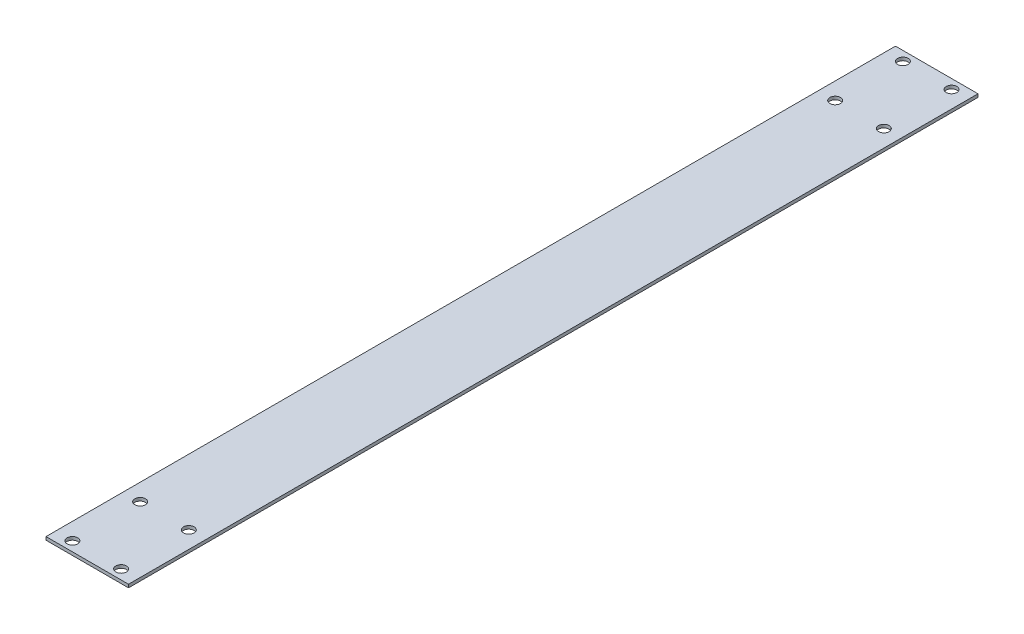
ISO-10303-21;
HEADER;
FILE_DESCRIPTION(('STEP AP214'),'2;1');
FILE_NAME('part.step','',(''),(''),'','','');
FILE_SCHEMA(('AUTOMOTIVE_DESIGN { 1 0 10303 214 1 1 1 1 }'));
ENDSEC;
DATA;
#1=APPLICATION_CONTEXT('core data for automotive mechanical design processes');
#2=APPLICATION_PROTOCOL_DEFINITION('international standard','automotive_design',2000,#1);
#3=PRODUCT_CONTEXT('',#1,'mechanical');
#4=PRODUCT('Part','Part','',(#3));
#5=PRODUCT_RELATED_PRODUCT_CATEGORY('part','',(#4));
#6=PRODUCT_DEFINITION_FORMATION('','',#4);
#7=PRODUCT_DEFINITION_CONTEXT('part definition',#1,'design');
#8=PRODUCT_DEFINITION('design','',#6,#7);
#9=PRODUCT_DEFINITION_SHAPE('','',#8);
#10=(LENGTH_UNIT() NAMED_UNIT(*) SI_UNIT(.MILLI.,.METRE.));
#11=(NAMED_UNIT(*) PLANE_ANGLE_UNIT() SI_UNIT($,.RADIAN.));
#12=(NAMED_UNIT(*) SI_UNIT($,.STERADIAN.) SOLID_ANGLE_UNIT());
#13=UNCERTAINTY_MEASURE_WITH_UNIT(LENGTH_MEASURE(1.E-05),#10,'distance_accuracy_value','');
#14=(GEOMETRIC_REPRESENTATION_CONTEXT(3) GLOBAL_UNCERTAINTY_ASSIGNED_CONTEXT((#13)) GLOBAL_UNIT_ASSIGNED_CONTEXT((#10,
#11,#12)) REPRESENTATION_CONTEXT('',''));
#15=CARTESIAN_POINT('',(0.,0.,0.));
#16=DIRECTION('',(0.,0.,1.));
#17=DIRECTION('',(1.,0.,0.));
#18=AXIS2_PLACEMENT_3D('',#15,#16,#17);
#19=CARTESIAN_POINT('',(0.,0.,401.5));
#20=DIRECTION('',(0.,1.,0.));
#21=DIRECTION('',(0.,0.,1.));
#22=AXIS2_PLACEMENT_3D('',#19,#20,#21);
#23=PLANE('',#22);
#24=CARTESIAN_POINT('',(8.,0.,365.));
#25=DIRECTION('',(0.,1.,0.));
#26=DIRECTION('',(0.,0.,-1.));
#27=AXIS2_PLACEMENT_3D('',#24,#25,#26);
#28=CIRCLE('',#27,2.5);
#29=CARTESIAN_POINT('',(8.,0.,362.5));
#30=VERTEX_POINT('',#29);
#31=EDGE_CURVE('E148',#30,#30,#28,.T.);
#32=ORIENTED_EDGE('',*,*,#31,.T.);
#33=EDGE_LOOP('',(#32));
#34=FACE_BOUND('',#33,.T.);
#35=CARTESIAN_POINT('',(8.,0.,36.5));
#36=DIRECTION('',(0.,1.,0.));
#37=DIRECTION('',(0.,0.,1.));
#38=AXIS2_PLACEMENT_3D('',#35,#36,#37);
#39=CIRCLE('',#38,2.5);
#40=CARTESIAN_POINT('',(8.,0.,39.));
#41=VERTEX_POINT('',#40);
#42=EDGE_CURVE('E136',#41,#41,#39,.T.);
#43=ORIENTED_EDGE('',*,*,#42,.T.);
#44=EDGE_LOOP('',(#43));
#45=FACE_BOUND('',#44,.T.);
#46=CARTESIAN_POINT('',(31.,0.,36.5));
#47=DIRECTION('',(0.,1.,0.));
#48=DIRECTION('',(0.,0.,-1.));
#49=AXIS2_PLACEMENT_3D('',#46,#47,#48);
#50=CIRCLE('',#49,2.5);
#51=CARTESIAN_POINT('',(31.,0.,34.));
#52=VERTEX_POINT('',#51);
#53=EDGE_CURVE('E124',#52,#52,#50,.T.);
#54=ORIENTED_EDGE('',*,*,#53,.T.);
#55=EDGE_LOOP('',(#54));
#56=FACE_BOUND('',#55,.T.);
#57=CARTESIAN_POINT('',(8.,0.,397.));
#58=DIRECTION('',(0.,1.,0.));
#59=DIRECTION('',(0.,0.,1.));
#60=AXIS2_PLACEMENT_3D('',#57,#58,#59);
#61=CIRCLE('',#60,2.5);
#62=CARTESIAN_POINT('',(8.,0.,399.5));
#63=VERTEX_POINT('',#62);
#64=EDGE_CURVE('E112',#63,#63,#61,.T.);
#65=ORIENTED_EDGE('',*,*,#64,.T.);
#66=EDGE_LOOP('',(#65));
#67=FACE_BOUND('',#66,.T.);
#68=DIRECTION('',(1.,0.,0.));
#69=VECTOR('',#68,1.);
#70=CARTESIAN_POINT('',(0.,0.,0.));
#71=LINE('',#70,#69);
#72=CARTESIAN_POINT('',(0.,0.,0.));
#73=VERTEX_POINT('',#72);
#74=CARTESIAN_POINT('',(39.,0.,0.));
#75=VERTEX_POINT('',#74);
#76=EDGE_CURVE('E89',#73,#75,#71,.T.);
#77=ORIENTED_EDGE('',*,*,#76,.T.);
#78=DIRECTION('',(0.,0.,-1.));
#79=VECTOR('',#78,1.);
#80=CARTESIAN_POINT('',(39.,0.,401.5));
#81=LINE('',#80,#79);
#82=CARTESIAN_POINT('',(39.,0.,401.5));
#83=VERTEX_POINT('',#82);
#84=EDGE_CURVE('E42',#83,#75,#81,.T.);
#85=ORIENTED_EDGE('',*,*,#84,.F.);
#86=DIRECTION('',(1.,0.,0.));
#87=VECTOR('',#86,1.);
#88=CARTESIAN_POINT('',(0.,0.,401.5));
#89=LINE('',#88,#87);
#90=CARTESIAN_POINT('',(0.,0.,401.5));
#91=VERTEX_POINT('',#90);
#92=EDGE_CURVE('E80',#91,#83,#89,.T.);
#93=ORIENTED_EDGE('',*,*,#92,.F.);
#94=DIRECTION('',(0.,0.,-1.));
#95=VECTOR('',#94,1.);
#96=CARTESIAN_POINT('',(0.,0.,401.5));
#97=LINE('',#96,#95);
#98=EDGE_CURVE('E11',#91,#73,#97,.T.);
#99=ORIENTED_EDGE('',*,*,#98,.T.);
#100=EDGE_LOOP('',(#77,#85,#93,#99));
#101=FACE_BOUND('',#100,.T.);
#102=CARTESIAN_POINT('',(31.,0.,365.));
#103=DIRECTION('',(0.,1.,0.));
#104=DIRECTION('',(0.,0.,1.));
#105=AXIS2_PLACEMENT_3D('',#102,#103,#104);
#106=CIRCLE('',#105,2.5);
#107=CARTESIAN_POINT('',(31.,0.,367.5));
#108=VERTEX_POINT('',#107);
#109=EDGE_CURVE('E118',#108,#108,#106,.T.);
#110=ORIENTED_EDGE('',*,*,#109,.T.);
#111=EDGE_LOOP('',(#110));
#112=FACE_BOUND('',#111,.T.);
#113=CARTESIAN_POINT('',(8.,0.,4.5));
#114=DIRECTION('',(0.,1.,0.));
#115=DIRECTION('',(0.,0.,-1.));
#116=AXIS2_PLACEMENT_3D('',#113,#114,#115);
#117=CIRCLE('',#116,2.5);
#118=CARTESIAN_POINT('',(8.,0.,2.));
#119=VERTEX_POINT('',#118);
#120=EDGE_CURVE('E130',#119,#119,#117,.T.);
#121=ORIENTED_EDGE('',*,*,#120,.T.);
#122=EDGE_LOOP('',(#121));
#123=FACE_BOUND('',#122,.T.);
#124=CARTESIAN_POINT('',(31.,0.,4.5));
#125=DIRECTION('',(0.,1.,0.));
#126=DIRECTION('',(0.,0.,1.));
#127=AXIS2_PLACEMENT_3D('',#124,#125,#126);
#128=CIRCLE('',#127,2.5);
#129=CARTESIAN_POINT('',(31.,0.,7.00000000000001));
#130=VERTEX_POINT('',#129);
#131=EDGE_CURVE('E142',#130,#130,#128,.T.);
#132=ORIENTED_EDGE('',*,*,#131,.T.);
#133=EDGE_LOOP('',(#132));
#134=FACE_BOUND('',#133,.T.);
#135=CARTESIAN_POINT('',(31.,0.,397.));
#136=DIRECTION('',(0.,1.,0.));
#137=DIRECTION('',(0.,0.,-1.));
#138=AXIS2_PLACEMENT_3D('',#135,#136,#137);
#139=CIRCLE('',#138,2.5);
#140=CARTESIAN_POINT('',(31.,0.,394.5));
#141=VERTEX_POINT('',#140);
#142=EDGE_CURVE('E154',#141,#141,#139,.T.);
#143=ORIENTED_EDGE('',*,*,#142,.T.);
#144=EDGE_LOOP('',(#143));
#145=FACE_BOUND('',#144,.T.);
#146=ADVANCED_FACE('F33',(#34,#45,#56,#67,#101,#112,#123,#134,#145),#23,.F.);
#147=CARTESIAN_POINT('',(0.,1.5,401.5));
#148=DIRECTION('',(0.,-1.,0.));
#149=DIRECTION('',(0.,0.,-1.));
#150=AXIS2_PLACEMENT_3D('',#147,#148,#149);
#151=PLANE('',#150);
#152=CARTESIAN_POINT('',(8.,1.5,365.));
#153=DIRECTION('',(0.,1.,0.));
#154=DIRECTION('',(0.,0.,-1.));
#155=AXIS2_PLACEMENT_3D('',#152,#153,#154);
#156=CIRCLE('',#155,2.5);
#157=CARTESIAN_POINT('',(8.,1.5,362.5));
#158=VERTEX_POINT('',#157);
#159=EDGE_CURVE('E145',#158,#158,#156,.T.);
#160=ORIENTED_EDGE('',*,*,#159,.F.);
#161=EDGE_LOOP('',(#160));
#162=FACE_BOUND('',#161,.T.);
#163=CARTESIAN_POINT('',(8.,1.5,36.5));
#164=DIRECTION('',(0.,1.,0.));
#165=DIRECTION('',(0.,0.,1.));
#166=AXIS2_PLACEMENT_3D('',#163,#164,#165);
#167=CIRCLE('',#166,2.5);
#168=CARTESIAN_POINT('',(8.,1.5,39.));
#169=VERTEX_POINT('',#168);
#170=EDGE_CURVE('E133',#169,#169,#167,.T.);
#171=ORIENTED_EDGE('',*,*,#170,.F.);
#172=EDGE_LOOP('',(#171));
#173=FACE_BOUND('',#172,.T.);
#174=CARTESIAN_POINT('',(31.,1.5,36.5));
#175=DIRECTION('',(0.,1.,0.));
#176=DIRECTION('',(0.,0.,-1.));
#177=AXIS2_PLACEMENT_3D('',#174,#175,#176);
#178=CIRCLE('',#177,2.5);
#179=CARTESIAN_POINT('',(31.,1.5,34.));
#180=VERTEX_POINT('',#179);
#181=EDGE_CURVE('E121',#180,#180,#178,.T.);
#182=ORIENTED_EDGE('',*,*,#181,.F.);
#183=EDGE_LOOP('',(#182));
#184=FACE_BOUND('',#183,.T.);
#185=CARTESIAN_POINT('',(8.,1.5,397.));
#186=DIRECTION('',(0.,1.,0.));
#187=DIRECTION('',(0.,0.,1.));
#188=AXIS2_PLACEMENT_3D('',#185,#186,#187);
#189=CIRCLE('',#188,2.5);
#190=CARTESIAN_POINT('',(8.,1.5,399.5));
#191=VERTEX_POINT('',#190);
#192=EDGE_CURVE('E100',#191,#191,#189,.T.);
#193=ORIENTED_EDGE('',*,*,#192,.F.);
#194=EDGE_LOOP('',(#193));
#195=FACE_BOUND('',#194,.T.);
#196=DIRECTION('',(-1.,0.,0.));
#197=VECTOR('',#196,1.);
#198=CARTESIAN_POINT('',(0.,1.5,0.));
#199=LINE('',#198,#197);
#200=CARTESIAN_POINT('',(39.,1.5,0.));
#201=VERTEX_POINT('',#200);
#202=CARTESIAN_POINT('',(0.,1.5,0.));
#203=VERTEX_POINT('',#202);
#204=EDGE_CURVE('E73',#201,#203,#199,.T.);
#205=ORIENTED_EDGE('',*,*,#204,.T.);
#206=DIRECTION('',(0.,0.,-1.));
#207=VECTOR('',#206,1.);
#208=CARTESIAN_POINT('',(0.,1.5,401.5));
#209=LINE('',#208,#207);
#210=CARTESIAN_POINT('',(0.,1.5,401.5));
#211=VERTEX_POINT('',#210);
#212=EDGE_CURVE('E93',#211,#203,#209,.T.);
#213=ORIENTED_EDGE('',*,*,#212,.F.);
#214=DIRECTION('',(-1.,0.,0.));
#215=VECTOR('',#214,1.);
#216=CARTESIAN_POINT('',(0.,1.5,401.5));
#217=LINE('',#216,#215);
#218=CARTESIAN_POINT('',(39.,1.5,401.5));
#219=VERTEX_POINT('',#218);
#220=EDGE_CURVE('E50',#219,#211,#217,.T.);
#221=ORIENTED_EDGE('',*,*,#220,.F.);
#222=DIRECTION('',(0.,0.,-1.));
#223=VECTOR('',#222,1.);
#224=CARTESIAN_POINT('',(39.,1.5,401.5));
#225=LINE('',#224,#223);
#226=EDGE_CURVE('E90',#219,#201,#225,.T.);
#227=ORIENTED_EDGE('',*,*,#226,.T.);
#228=EDGE_LOOP('',(#205,#213,#221,#227));
#229=FACE_BOUND('',#228,.T.);
#230=CARTESIAN_POINT('',(31.,1.5,365.));
#231=DIRECTION('',(0.,1.,0.));
#232=DIRECTION('',(0.,0.,1.));
#233=AXIS2_PLACEMENT_3D('',#230,#231,#232);
#234=CIRCLE('',#233,2.5);
#235=CARTESIAN_POINT('',(31.,1.5,367.5));
#236=VERTEX_POINT('',#235);
#237=EDGE_CURVE('E115',#236,#236,#234,.T.);
#238=ORIENTED_EDGE('',*,*,#237,.F.);
#239=EDGE_LOOP('',(#238));
#240=FACE_BOUND('',#239,.T.);
#241=CARTESIAN_POINT('',(8.,1.5,4.5));
#242=DIRECTION('',(0.,1.,0.));
#243=DIRECTION('',(0.,0.,-1.));
#244=AXIS2_PLACEMENT_3D('',#241,#242,#243);
#245=CIRCLE('',#244,2.5);
#246=CARTESIAN_POINT('',(8.,1.5,2.));
#247=VERTEX_POINT('',#246);
#248=EDGE_CURVE('E127',#247,#247,#245,.T.);
#249=ORIENTED_EDGE('',*,*,#248,.F.);
#250=EDGE_LOOP('',(#249));
#251=FACE_BOUND('',#250,.T.);
#252=CARTESIAN_POINT('',(31.,1.5,4.5));
#253=DIRECTION('',(0.,1.,0.));
#254=DIRECTION('',(0.,0.,1.));
#255=AXIS2_PLACEMENT_3D('',#252,#253,#254);
#256=CIRCLE('',#255,2.5);
#257=CARTESIAN_POINT('',(31.,1.5,7.00000000000001));
#258=VERTEX_POINT('',#257);
#259=EDGE_CURVE('E139',#258,#258,#256,.T.);
#260=ORIENTED_EDGE('',*,*,#259,.F.);
#261=EDGE_LOOP('',(#260));
#262=FACE_BOUND('',#261,.T.);
#263=CARTESIAN_POINT('',(31.,1.5,397.));
#264=DIRECTION('',(0.,1.,0.));
#265=DIRECTION('',(0.,0.,-1.));
#266=AXIS2_PLACEMENT_3D('',#263,#264,#265);
#267=CIRCLE('',#266,2.5);
#268=CARTESIAN_POINT('',(31.,1.5,394.5));
#269=VERTEX_POINT('',#268);
#270=EDGE_CURVE('E151',#269,#269,#267,.T.);
#271=ORIENTED_EDGE('',*,*,#270,.F.);
#272=EDGE_LOOP('',(#271));
#273=FACE_BOUND('',#272,.T.);
#274=ADVANCED_FACE('F105',(#162,#173,#184,#195,#229,#240,#251,#262,#273),#151,.F.);
#275=CARTESIAN_POINT('',(0.,0.,401.5));
#276=DIRECTION('',(1.,0.,0.));
#277=DIRECTION('',(0.,0.,-1.));
#278=AXIS2_PLACEMENT_3D('',#275,#276,#277);
#279=PLANE('',#278);
#280=DIRECTION('',(0.,-1.,0.));
#281=VECTOR('',#280,1.);
#282=CARTESIAN_POINT('',(0.,0.,0.));
#283=LINE('',#282,#281);
#284=EDGE_CURVE('E97',#203,#73,#283,.T.);
#285=ORIENTED_EDGE('',*,*,#284,.T.);
#286=ORIENTED_EDGE('',*,*,#98,.F.);
#287=DIRECTION('',(0.,-1.,0.));
#288=VECTOR('',#287,1.);
#289=CARTESIAN_POINT('',(0.,0.,401.5));
#290=LINE('',#289,#288);
#291=EDGE_CURVE('E85',#211,#91,#290,.T.);
#292=ORIENTED_EDGE('',*,*,#291,.F.);
#293=ORIENTED_EDGE('',*,*,#212,.T.);
#294=EDGE_LOOP('',(#285,#286,#292,#293));
#295=FACE_BOUND('',#294,.T.);
#296=ADVANCED_FACE('F35',(#295),#279,.F.);
#297=CARTESIAN_POINT('',(39.,0.,401.5));
#298=DIRECTION('',(-1.,0.,0.));
#299=DIRECTION('',(0.,0.,1.));
#300=AXIS2_PLACEMENT_3D('',#297,#298,#299);
#301=PLANE('',#300);
#302=DIRECTION('',(0.,1.,0.));
#303=VECTOR('',#302,1.);
#304=CARTESIAN_POINT('',(39.,0.,0.));
#305=LINE('',#304,#303);
#306=EDGE_CURVE('E67',#75,#201,#305,.T.);
#307=ORIENTED_EDGE('',*,*,#306,.T.);
#308=ORIENTED_EDGE('',*,*,#226,.F.);
#309=DIRECTION('',(0.,1.,0.));
#310=VECTOR('',#309,1.);
#311=CARTESIAN_POINT('',(39.,0.,401.5));
#312=LINE('',#311,#310);
#313=EDGE_CURVE('E83',#83,#219,#312,.T.);
#314=ORIENTED_EDGE('',*,*,#313,.F.);
#315=ORIENTED_EDGE('',*,*,#84,.T.);
#316=EDGE_LOOP('',(#307,#308,#314,#315));
#317=FACE_BOUND('',#316,.T.);
#318=ADVANCED_FACE('F91',(#317),#301,.F.);
#319=CARTESIAN_POINT('',(0.,0.,401.5));
#320=DIRECTION('',(0.,0.,-1.));
#321=DIRECTION('',(-1.,0.,0.));
#322=AXIS2_PLACEMENT_3D('',#319,#320,#321);
#323=PLANE('',#322);
#324=ORIENTED_EDGE('',*,*,#291,.T.);
#325=ORIENTED_EDGE('',*,*,#92,.T.);
#326=ORIENTED_EDGE('',*,*,#313,.T.);
#327=ORIENTED_EDGE('',*,*,#220,.T.);
#328=EDGE_LOOP('',(#324,#325,#326,#327));
#329=FACE_BOUND('',#328,.T.);
#330=ADVANCED_FACE('F81',(#329),#323,.F.);
#331=CARTESIAN_POINT('',(0.,0.,0.));
#332=DIRECTION('',(0.,0.,-1.));
#333=DIRECTION('',(-1.,0.,0.));
#334=AXIS2_PLACEMENT_3D('',#331,#332,#333);
#335=PLANE('',#334);
#336=ORIENTED_EDGE('',*,*,#284,.F.);
#337=ORIENTED_EDGE('',*,*,#204,.F.);
#338=ORIENTED_EDGE('',*,*,#306,.F.);
#339=ORIENTED_EDGE('',*,*,#76,.F.);
#340=EDGE_LOOP('',(#336,#337,#338,#339));
#341=FACE_BOUND('',#340,.T.);
#342=ADVANCED_FACE('F109',(#341),#335,.T.);
#343=CARTESIAN_POINT('',(8.,1.5,397.));
#344=DIRECTION('',(0.,-1.,0.));
#345=DIRECTION('',(0.,0.,-1.));
#346=AXIS2_PLACEMENT_3D('',#343,#344,#345);
#347=CYLINDRICAL_SURFACE('',#346,2.5);
#348=ORIENTED_EDGE('',*,*,#192,.T.);
#349=EDGE_LOOP('',(#348));
#350=FACE_BOUND('',#349,.T.);
#351=ORIENTED_EDGE('',*,*,#64,.F.);
#352=EDGE_LOOP('',(#351));
#353=FACE_BOUND('',#352,.T.);
#354=ADVANCED_FACE('F183',(#350,#353),#347,.F.);
#355=CARTESIAN_POINT('',(31.,1.5,365.));
#356=DIRECTION('',(0.,-1.,0.));
#357=DIRECTION('',(0.,0.,-1.));
#358=AXIS2_PLACEMENT_3D('',#355,#356,#357);
#359=CYLINDRICAL_SURFACE('',#358,2.5);
#360=ORIENTED_EDGE('',*,*,#237,.T.);
#361=EDGE_LOOP('',(#360));
#362=FACE_BOUND('',#361,.T.);
#363=ORIENTED_EDGE('',*,*,#109,.F.);
#364=EDGE_LOOP('',(#363));
#365=FACE_BOUND('',#364,.T.);
#366=ADVANCED_FACE('F187',(#362,#365),#359,.F.);
#367=CARTESIAN_POINT('',(31.,1.5,36.5));
#368=DIRECTION('',(0.,-1.,0.));
#369=DIRECTION('',(0.,0.,-1.));
#370=AXIS2_PLACEMENT_3D('',#367,#368,#369);
#371=CYLINDRICAL_SURFACE('',#370,2.5);
#372=ORIENTED_EDGE('',*,*,#181,.T.);
#373=EDGE_LOOP('',(#372));
#374=FACE_BOUND('',#373,.T.);
#375=ORIENTED_EDGE('',*,*,#53,.F.);
#376=EDGE_LOOP('',(#375));
#377=FACE_BOUND('',#376,.T.);
#378=ADVANCED_FACE('F191',(#374,#377),#371,.F.);
#379=CARTESIAN_POINT('',(8.,1.5,4.5));
#380=DIRECTION('',(0.,-1.,0.));
#381=DIRECTION('',(0.,0.,-1.));
#382=AXIS2_PLACEMENT_3D('',#379,#380,#381);
#383=CYLINDRICAL_SURFACE('',#382,2.5);
#384=ORIENTED_EDGE('',*,*,#248,.T.);
#385=EDGE_LOOP('',(#384));
#386=FACE_BOUND('',#385,.T.);
#387=ORIENTED_EDGE('',*,*,#120,.F.);
#388=EDGE_LOOP('',(#387));
#389=FACE_BOUND('',#388,.T.);
#390=ADVANCED_FACE('F195',(#386,#389),#383,.F.);
#391=CARTESIAN_POINT('',(8.,1.5,36.5));
#392=DIRECTION('',(0.,-1.,0.));
#393=DIRECTION('',(0.,0.,-1.));
#394=AXIS2_PLACEMENT_3D('',#391,#392,#393);
#395=CYLINDRICAL_SURFACE('',#394,2.5);
#396=ORIENTED_EDGE('',*,*,#170,.T.);
#397=EDGE_LOOP('',(#396));
#398=FACE_BOUND('',#397,.T.);
#399=ORIENTED_EDGE('',*,*,#42,.F.);
#400=EDGE_LOOP('',(#399));
#401=FACE_BOUND('',#400,.T.);
#402=ADVANCED_FACE('F199',(#398,#401),#395,.F.);
#403=CARTESIAN_POINT('',(31.,1.5,4.5));
#404=DIRECTION('',(0.,-1.,0.));
#405=DIRECTION('',(0.,0.,-1.));
#406=AXIS2_PLACEMENT_3D('',#403,#404,#405);
#407=CYLINDRICAL_SURFACE('',#406,2.5);
#408=ORIENTED_EDGE('',*,*,#259,.T.);
#409=EDGE_LOOP('',(#408));
#410=FACE_BOUND('',#409,.T.);
#411=ORIENTED_EDGE('',*,*,#131,.F.);
#412=EDGE_LOOP('',(#411));
#413=FACE_BOUND('',#412,.T.);
#414=ADVANCED_FACE('F203',(#410,#413),#407,.F.);
#415=CARTESIAN_POINT('',(8.,1.5,365.));
#416=DIRECTION('',(0.,-1.,0.));
#417=DIRECTION('',(0.,0.,-1.));
#418=AXIS2_PLACEMENT_3D('',#415,#416,#417);
#419=CYLINDRICAL_SURFACE('',#418,2.5);
#420=ORIENTED_EDGE('',*,*,#159,.T.);
#421=EDGE_LOOP('',(#420));
#422=FACE_BOUND('',#421,.T.);
#423=ORIENTED_EDGE('',*,*,#31,.F.);
#424=EDGE_LOOP('',(#423));
#425=FACE_BOUND('',#424,.T.);
#426=ADVANCED_FACE('F207',(#422,#425),#419,.F.);
#427=CARTESIAN_POINT('',(31.,1.5,397.));
#428=DIRECTION('',(0.,-1.,0.));
#429=DIRECTION('',(0.,0.,-1.));
#430=AXIS2_PLACEMENT_3D('',#427,#428,#429);
#431=CYLINDRICAL_SURFACE('',#430,2.5);
#432=ORIENTED_EDGE('',*,*,#270,.T.);
#433=EDGE_LOOP('',(#432));
#434=FACE_BOUND('',#433,.T.);
#435=ORIENTED_EDGE('',*,*,#142,.F.);
#436=EDGE_LOOP('',(#435));
#437=FACE_BOUND('',#436,.T.);
#438=ADVANCED_FACE('F160',(#434,#437),#431,.F.);
#439=CLOSED_SHELL('',(#146,#274,#296,#318,#330,#342,#354,#366,#378,#390,#402,#414,#426,#438));
#440=MANIFOLD_SOLID_BREP('B2',#439);
#441=ADVANCED_BREP_SHAPE_REPRESENTATION('',(#18,#440),#14);
#442=SHAPE_DEFINITION_REPRESENTATION(#9,#441);
ENDSEC;
END-ISO-10303-21;
